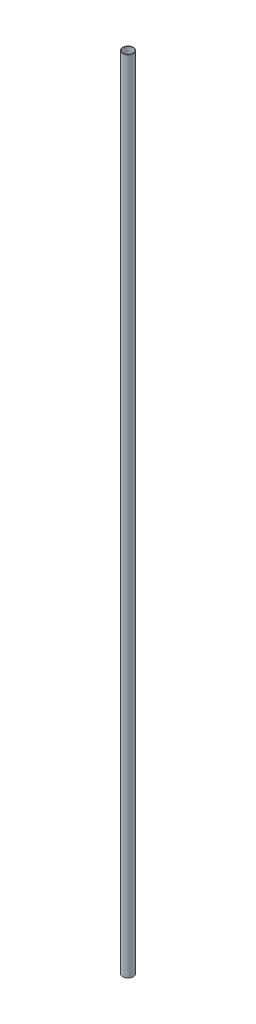
ISO-10303-21;
HEADER;
FILE_DESCRIPTION(('STEP AP214'),'2;1');
FILE_NAME('part.step','',(''),(''),'','','');
FILE_SCHEMA(('AUTOMOTIVE_DESIGN { 1 0 10303 214 1 1 1 1 }'));
ENDSEC;
DATA;
#1=APPLICATION_CONTEXT('core data for automotive mechanical design processes');
#2=APPLICATION_PROTOCOL_DEFINITION('international standard','automotive_design',2000,#1);
#3=PRODUCT_CONTEXT('',#1,'mechanical');
#4=PRODUCT('Part','Part','',(#3));
#5=PRODUCT_RELATED_PRODUCT_CATEGORY('part','',(#4));
#6=PRODUCT_DEFINITION_FORMATION('','',#4);
#7=PRODUCT_DEFINITION_CONTEXT('part definition',#1,'design');
#8=PRODUCT_DEFINITION('design','',#6,#7);
#9=PRODUCT_DEFINITION_SHAPE('','',#8);
#10=(LENGTH_UNIT() NAMED_UNIT(*) SI_UNIT(.MILLI.,.METRE.));
#11=(NAMED_UNIT(*) PLANE_ANGLE_UNIT() SI_UNIT($,.RADIAN.));
#12=(NAMED_UNIT(*) SI_UNIT($,.STERADIAN.) SOLID_ANGLE_UNIT());
#13=UNCERTAINTY_MEASURE_WITH_UNIT(LENGTH_MEASURE(1.E-05),#10,'distance_accuracy_value','');
#14=(GEOMETRIC_REPRESENTATION_CONTEXT(3) GLOBAL_UNCERTAINTY_ASSIGNED_CONTEXT((#13)) GLOBAL_UNIT_ASSIGNED_CONTEXT((#10,
#11,#12)) REPRESENTATION_CONTEXT('',''));
#15=CARTESIAN_POINT('',(0.,0.,0.));
#16=DIRECTION('',(0.,0.,1.));
#17=DIRECTION('',(1.,0.,0.));
#18=AXIS2_PLACEMENT_3D('',#15,#16,#17);
#19=CARTESIAN_POINT('',(0.,1016.,0.));
#20=DIRECTION('',(0.,1.,0.));
#21=DIRECTION('',(0.,0.,1.));
#22=AXIS2_PLACEMENT_3D('',#19,#20,#21);
#23=PLANE('',#22);
#24=CARTESIAN_POINT('',(0.,1016.,0.));
#25=DIRECTION('',(0.,1.,0.));
#26=DIRECTION('',(0.,0.,1.));
#27=AXIS2_PLACEMENT_3D('',#24,#25,#26);
#28=CIRCLE('',#27,6.858);
#29=CARTESIAN_POINT('',(0.,1016.,6.858));
#30=VERTEX_POINT('',#29);
#31=EDGE_CURVE('E10',#30,#30,#28,.T.);
#32=ORIENTED_EDGE('',*,*,#31,.T.);
#33=EDGE_LOOP('',(#32));
#34=FACE_BOUND('',#33,.T.);
#35=CARTESIAN_POINT('',(0.,1016.,0.));
#36=DIRECTION('',(0.,1.,0.));
#37=DIRECTION('',(0.,0.,1.));
#38=AXIS2_PLACEMENT_3D('',#35,#36,#37);
#39=CIRCLE('',#38,6.35);
#40=CARTESIAN_POINT('',(0.,1016.,6.35));
#41=VERTEX_POINT('',#40);
#42=EDGE_CURVE('E56',#41,#41,#39,.T.);
#43=ORIENTED_EDGE('',*,*,#42,.F.);
#44=EDGE_LOOP('',(#43));
#45=FACE_BOUND('',#44,.T.);
#46=ADVANCED_FACE('F43',(#34,#45),#23,.T.);
#47=CARTESIAN_POINT('',(0.,0.,0.));
#48=DIRECTION('',(0.,1.,0.));
#49=DIRECTION('',(0.,0.,1.));
#50=AXIS2_PLACEMENT_3D('',#47,#48,#49);
#51=PLANE('',#50);
#52=CARTESIAN_POINT('',(0.,0.,0.));
#53=DIRECTION('',(0.,1.,0.));
#54=DIRECTION('',(0.,0.,1.));
#55=AXIS2_PLACEMENT_3D('',#52,#53,#54);
#56=CIRCLE('',#55,6.858);
#57=CARTESIAN_POINT('',(0.,0.,6.858));
#58=VERTEX_POINT('',#57);
#59=EDGE_CURVE('E47',#58,#58,#56,.T.);
#60=ORIENTED_EDGE('',*,*,#59,.F.);
#61=EDGE_LOOP('',(#60));
#62=FACE_BOUND('',#61,.T.);
#63=CARTESIAN_POINT('',(0.,0.,0.));
#64=DIRECTION('',(0.,1.,0.));
#65=DIRECTION('',(0.,0.,1.));
#66=AXIS2_PLACEMENT_3D('',#63,#64,#65);
#67=CIRCLE('',#66,6.35);
#68=CARTESIAN_POINT('',(0.,0.,6.35));
#69=VERTEX_POINT('',#68);
#70=EDGE_CURVE('E58',#69,#69,#67,.T.);
#71=ORIENTED_EDGE('',*,*,#70,.T.);
#72=EDGE_LOOP('',(#71));
#73=FACE_BOUND('',#72,.T.);
#74=ADVANCED_FACE('F70',(#62,#73),#51,.F.);
#75=CARTESIAN_POINT('',(0.,1016.,0.));
#76=DIRECTION('',(0.,-1.,0.));
#77=DIRECTION('',(0.,0.,-1.));
#78=AXIS2_PLACEMENT_3D('',#75,#76,#77);
#79=CYLINDRICAL_SURFACE('',#78,6.858);
#80=ORIENTED_EDGE('',*,*,#31,.F.);
#81=EDGE_LOOP('',(#80));
#82=FACE_BOUND('',#81,.T.);
#83=ORIENTED_EDGE('',*,*,#59,.T.);
#84=EDGE_LOOP('',(#83));
#85=FACE_BOUND('',#84,.T.);
#86=ADVANCED_FACE('F45',(#82,#85),#79,.T.);
#87=CARTESIAN_POINT('',(0.,1016.,0.));
#88=DIRECTION('',(0.,-1.,0.));
#89=DIRECTION('',(0.,0.,-1.));
#90=AXIS2_PLACEMENT_3D('',#87,#88,#89);
#91=CYLINDRICAL_SURFACE('',#90,6.35);
#92=ORIENTED_EDGE('',*,*,#42,.T.);
#93=EDGE_LOOP('',(#92));
#94=FACE_BOUND('',#93,.T.);
#95=ORIENTED_EDGE('',*,*,#70,.F.);
#96=EDGE_LOOP('',(#95));
#97=FACE_BOUND('',#96,.T.);
#98=ADVANCED_FACE('F66',(#94,#97),#91,.F.);
#99=CLOSED_SHELL('',(#46,#74,#86,#98));
#100=MANIFOLD_SOLID_BREP('B2',#99);
#101=ADVANCED_BREP_SHAPE_REPRESENTATION('',(#18,#100),#14);
#102=SHAPE_DEFINITION_REPRESENTATION(#9,#101);
ENDSEC;
END-ISO-10303-21;
